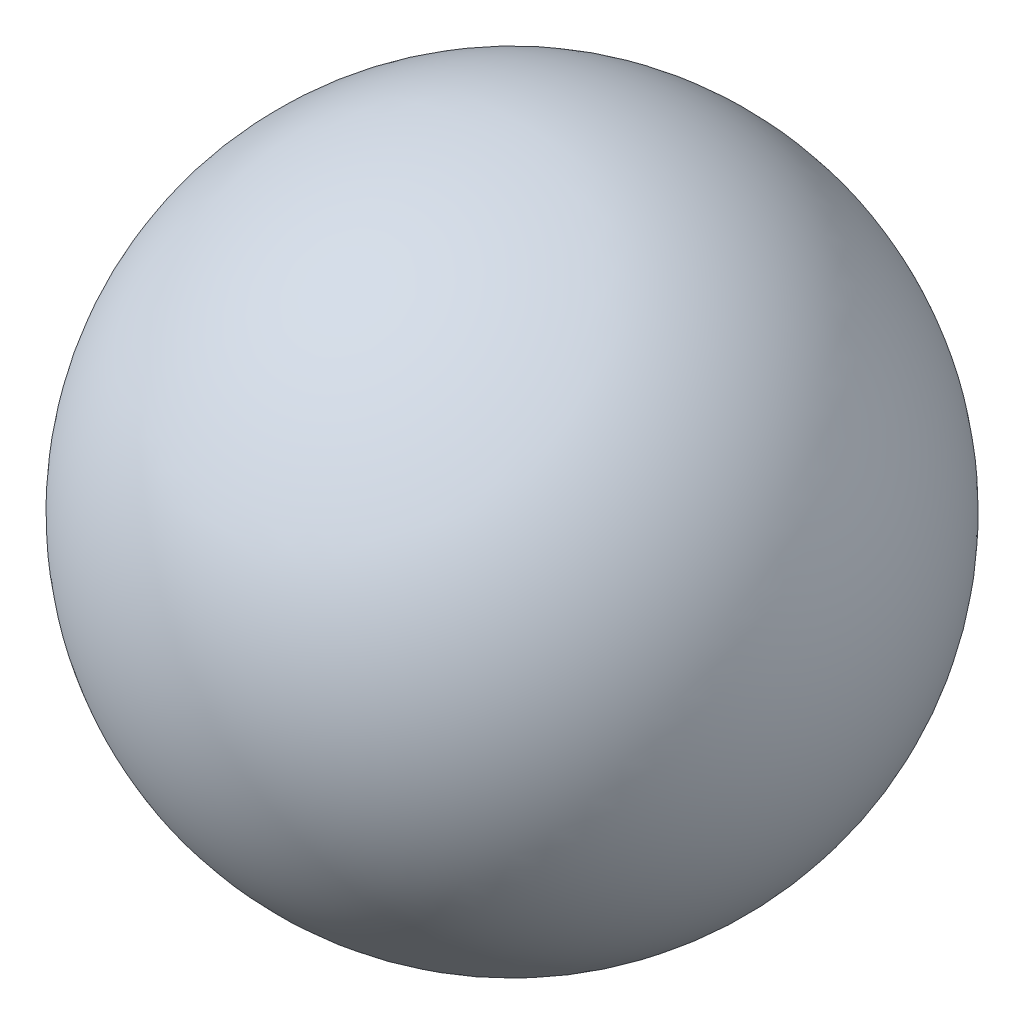
ISO-10303-21;
HEADER;
FILE_DESCRIPTION(('STEP AP214'),'2;1');
FILE_NAME('part.step','',(''),(''),'','','');
FILE_SCHEMA(('AUTOMOTIVE_DESIGN { 1 0 10303 214 1 1 1 1 }'));
ENDSEC;
DATA;
#1=APPLICATION_CONTEXT('core data for automotive mechanical design processes');
#2=APPLICATION_PROTOCOL_DEFINITION('international standard','automotive_design',2000,#1);
#3=PRODUCT_CONTEXT('',#1,'mechanical');
#4=PRODUCT('Part','Part','',(#3));
#5=PRODUCT_RELATED_PRODUCT_CATEGORY('part','',(#4));
#6=PRODUCT_DEFINITION_FORMATION('','',#4);
#7=PRODUCT_DEFINITION_CONTEXT('part definition',#1,'design');
#8=PRODUCT_DEFINITION('design','',#6,#7);
#9=PRODUCT_DEFINITION_SHAPE('','',#8);
#10=(LENGTH_UNIT() NAMED_UNIT(*) SI_UNIT(.MILLI.,.METRE.));
#11=(NAMED_UNIT(*) PLANE_ANGLE_UNIT() SI_UNIT($,.RADIAN.));
#12=(NAMED_UNIT(*) SI_UNIT($,.STERADIAN.) SOLID_ANGLE_UNIT());
#13=UNCERTAINTY_MEASURE_WITH_UNIT(LENGTH_MEASURE(1.E-05),#10,'distance_accuracy_value','');
#14=(GEOMETRIC_REPRESENTATION_CONTEXT(3) GLOBAL_UNCERTAINTY_ASSIGNED_CONTEXT((#13)) GLOBAL_UNIT_ASSIGNED_CONTEXT((#10,
#11,#12)) REPRESENTATION_CONTEXT('',''));
#15=CARTESIAN_POINT('',(0.,0.,0.));
#16=DIRECTION('',(0.,0.,1.));
#17=DIRECTION('',(1.,0.,0.));
#18=AXIS2_PLACEMENT_3D('',#15,#16,#17);
#19=CARTESIAN_POINT('',(0.,0.,0.));
#20=DIRECTION('',(0.,0.,1.));
#21=DIRECTION('',(-1.,0.,0.));
#22=AXIS2_PLACEMENT_3D('',#19,#20,#21);
#23=SPHERICAL_SURFACE('',#22,1.325);
#24=CARTESIAN_POINT('',(0.,0.,1.325));
#25=VERTEX_POINT('',#24);
#26=VERTEX_LOOP('',#25);
#27=FACE_BOUND('',#26,.T.);
#28=ADVANCED_FACE('F33',(#27),#23,.T.);
#29=CLOSED_SHELL('',(#28));
#30=MANIFOLD_SOLID_BREP('B2',#29);
#31=ADVANCED_BREP_SHAPE_REPRESENTATION('',(#18,#30),#14);
#32=SHAPE_DEFINITION_REPRESENTATION(#9,#31);
ENDSEC;
END-ISO-10303-21;
